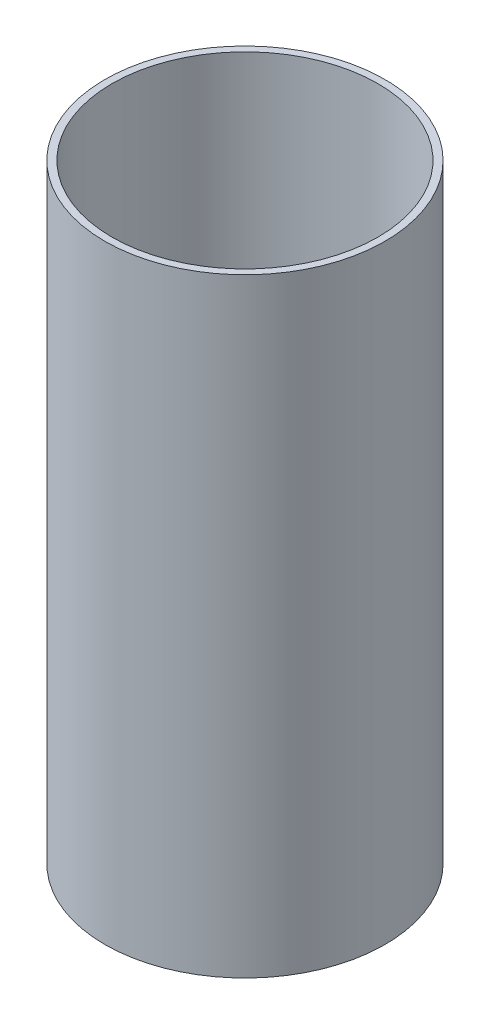
ISO-10303-21;
HEADER;
FILE_DESCRIPTION(('STEP AP214'),'2;1');
FILE_NAME('part.step','',(''),(''),'','','');
FILE_SCHEMA(('AUTOMOTIVE_DESIGN { 1 0 10303 214 1 1 1 1 }'));
ENDSEC;
DATA;
#1=APPLICATION_CONTEXT('core data for automotive mechanical design processes');
#2=APPLICATION_PROTOCOL_DEFINITION('international standard','automotive_design',2000,#1);
#3=PRODUCT_CONTEXT('',#1,'mechanical');
#4=PRODUCT('Part','Part','',(#3));
#5=PRODUCT_RELATED_PRODUCT_CATEGORY('part','',(#4));
#6=PRODUCT_DEFINITION_FORMATION('','',#4);
#7=PRODUCT_DEFINITION_CONTEXT('part definition',#1,'design');
#8=PRODUCT_DEFINITION('design','',#6,#7);
#9=PRODUCT_DEFINITION_SHAPE('','',#8);
#10=(LENGTH_UNIT() NAMED_UNIT(*) SI_UNIT(.MILLI.,.METRE.));
#11=(NAMED_UNIT(*) PLANE_ANGLE_UNIT() SI_UNIT($,.RADIAN.));
#12=(NAMED_UNIT(*) SI_UNIT($,.STERADIAN.) SOLID_ANGLE_UNIT());
#13=UNCERTAINTY_MEASURE_WITH_UNIT(LENGTH_MEASURE(1.E-05),#10,'distance_accuracy_value','');
#14=(GEOMETRIC_REPRESENTATION_CONTEXT(3) GLOBAL_UNCERTAINTY_ASSIGNED_CONTEXT((#13)) GLOBAL_UNIT_ASSIGNED_CONTEXT((#10,
#11,#12)) REPRESENTATION_CONTEXT('',''));
#15=CARTESIAN_POINT('',(0.,0.,0.));
#16=DIRECTION('',(0.,0.,1.));
#17=DIRECTION('',(1.,0.,0.));
#18=AXIS2_PLACEMENT_3D('',#15,#16,#17);
#19=CARTESIAN_POINT('',(0.,203.581,0.));
#20=DIRECTION('',(0.,1.,0.));
#21=DIRECTION('',(0.,0.,1.));
#22=AXIS2_PLACEMENT_3D('',#19,#20,#21);
#23=PLANE('',#22);
#24=CARTESIAN_POINT('',(0.,203.581,0.));
#25=DIRECTION('',(0.,1.,0.));
#26=DIRECTION('',(0.,0.,1.));
#27=AXIS2_PLACEMENT_3D('',#24,#25,#26);
#28=CIRCLE('',#27,93.6625);
#29=CARTESIAN_POINT('',(0.,203.581,93.6625));
#30=VERTEX_POINT('',#29);
#31=EDGE_CURVE('E10',#30,#30,#28,.T.);
#32=ORIENTED_EDGE('',*,*,#31,.T.);
#33=EDGE_LOOP('',(#32));
#34=FACE_BOUND('',#33,.T.);
#35=CARTESIAN_POINT('',(0.,203.581,0.));
#36=DIRECTION('',(0.,1.,0.));
#37=DIRECTION('',(0.,0.,1.));
#38=AXIS2_PLACEMENT_3D('',#35,#36,#37);
#39=CIRCLE('',#38,88.9);
#40=CARTESIAN_POINT('',(0.,203.581,88.9));
#41=VERTEX_POINT('',#40);
#42=EDGE_CURVE('E52',#41,#41,#39,.T.);
#43=ORIENTED_EDGE('',*,*,#42,.F.);
#44=EDGE_LOOP('',(#43));
#45=FACE_BOUND('',#44,.T.);
#46=ADVANCED_FACE('F41',(#34,#45),#23,.T.);
#47=CARTESIAN_POINT('',(0.,-203.581,0.));
#48=DIRECTION('',(0.,1.,0.));
#49=DIRECTION('',(0.,0.,1.));
#50=AXIS2_PLACEMENT_3D('',#47,#48,#49);
#51=PLANE('',#50);
#52=CARTESIAN_POINT('',(0.,-203.581,0.));
#53=DIRECTION('',(0.,1.,0.));
#54=DIRECTION('',(0.,0.,1.));
#55=AXIS2_PLACEMENT_3D('',#52,#53,#54);
#56=CIRCLE('',#55,93.6625);
#57=CARTESIAN_POINT('',(0.,-203.581,93.6625));
#58=VERTEX_POINT('',#57);
#59=EDGE_CURVE('E45',#58,#58,#56,.T.);
#60=ORIENTED_EDGE('',*,*,#59,.F.);
#61=EDGE_LOOP('',(#60));
#62=FACE_BOUND('',#61,.T.);
#63=CARTESIAN_POINT('',(0.,-203.581,0.));
#64=DIRECTION('',(0.,1.,0.));
#65=DIRECTION('',(0.,0.,1.));
#66=AXIS2_PLACEMENT_3D('',#63,#64,#65);
#67=CIRCLE('',#66,88.9);
#68=CARTESIAN_POINT('',(0.,-203.581,88.9));
#69=VERTEX_POINT('',#68);
#70=EDGE_CURVE('E54',#69,#69,#67,.T.);
#71=ORIENTED_EDGE('',*,*,#70,.T.);
#72=EDGE_LOOP('',(#71));
#73=FACE_BOUND('',#72,.T.);
#74=ADVANCED_FACE('F64',(#62,#73),#51,.F.);
#75=CARTESIAN_POINT('',(0.,203.581,0.));
#76=DIRECTION('',(0.,-1.,0.));
#77=DIRECTION('',(0.,0.,-1.));
#78=AXIS2_PLACEMENT_3D('',#75,#76,#77);
#79=CYLINDRICAL_SURFACE('',#78,93.6625);
#80=ORIENTED_EDGE('',*,*,#31,.F.);
#81=EDGE_LOOP('',(#80));
#82=FACE_BOUND('',#81,.T.);
#83=ORIENTED_EDGE('',*,*,#59,.T.);
#84=EDGE_LOOP('',(#83));
#85=FACE_BOUND('',#84,.T.);
#86=ADVANCED_FACE('F43',(#82,#85),#79,.T.);
#87=CARTESIAN_POINT('',(0.,203.581,0.));
#88=DIRECTION('',(0.,-1.,0.));
#89=DIRECTION('',(0.,0.,-1.));
#90=AXIS2_PLACEMENT_3D('',#87,#88,#89);
#91=CYLINDRICAL_SURFACE('',#90,88.9);
#92=ORIENTED_EDGE('',*,*,#42,.T.);
#93=EDGE_LOOP('',(#92));
#94=FACE_BOUND('',#93,.T.);
#95=ORIENTED_EDGE('',*,*,#70,.F.);
#96=EDGE_LOOP('',(#95));
#97=FACE_BOUND('',#96,.T.);
#98=ADVANCED_FACE('F60',(#94,#97),#91,.F.);
#99=CLOSED_SHELL('',(#46,#74,#86,#98));
#100=MANIFOLD_SOLID_BREP('B2',#99);
#101=ADVANCED_BREP_SHAPE_REPRESENTATION('',(#18,#100),#14);
#102=SHAPE_DEFINITION_REPRESENTATION(#9,#101);
ENDSEC;
END-ISO-10303-21;
